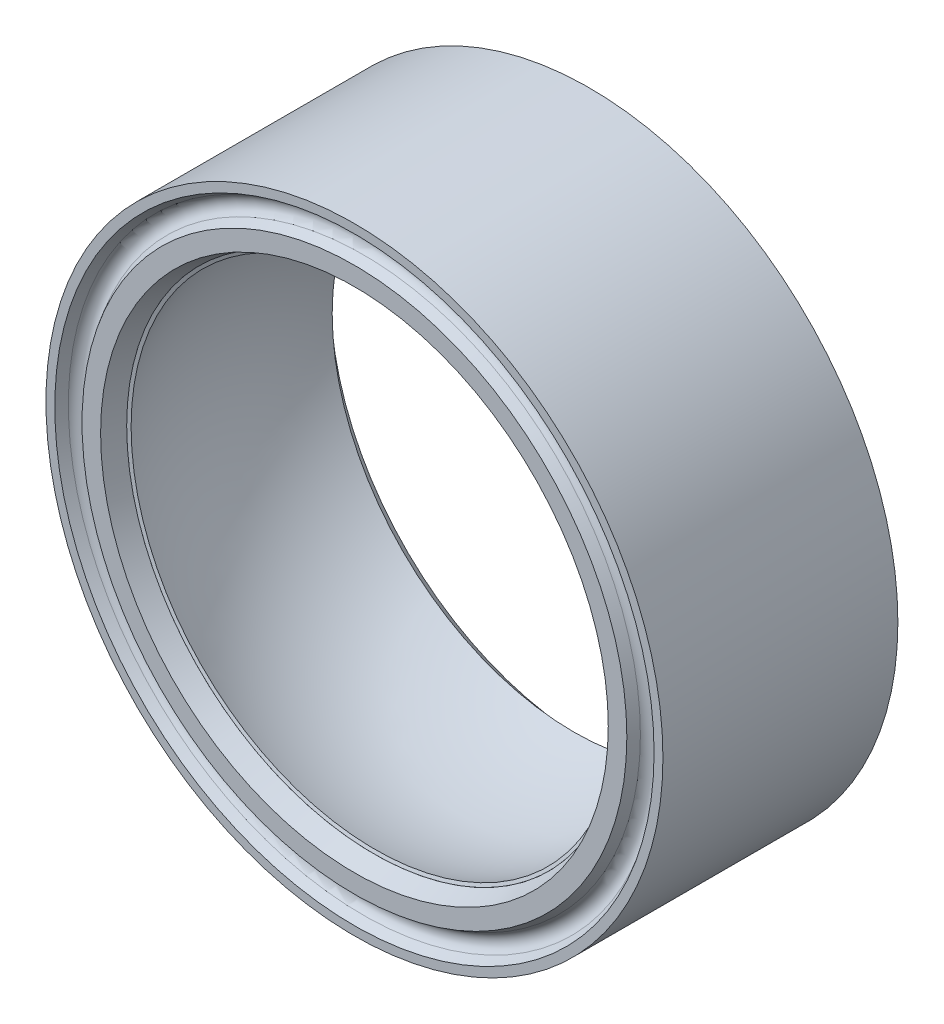
ISO-10303-21;
HEADER;
FILE_DESCRIPTION(('STEP AP214'),'2;1');
FILE_NAME('part.step','',(''),(''),'','','');
FILE_SCHEMA(('AUTOMOTIVE_DESIGN { 1 0 10303 214 1 1 1 1 }'));
ENDSEC;
DATA;
#1=APPLICATION_CONTEXT('core data for automotive mechanical design processes');
#2=APPLICATION_PROTOCOL_DEFINITION('international standard','automotive_design',2000,#1);
#3=PRODUCT_CONTEXT('',#1,'mechanical');
#4=PRODUCT('Part','Part','',(#3));
#5=PRODUCT_RELATED_PRODUCT_CATEGORY('part','',(#4));
#6=PRODUCT_DEFINITION_FORMATION('','',#4);
#7=PRODUCT_DEFINITION_CONTEXT('part definition',#1,'design');
#8=PRODUCT_DEFINITION('design','',#6,#7);
#9=PRODUCT_DEFINITION_SHAPE('','',#8);
#10=(LENGTH_UNIT() NAMED_UNIT(*) SI_UNIT(.MILLI.,.METRE.));
#11=(NAMED_UNIT(*) PLANE_ANGLE_UNIT() SI_UNIT($,.RADIAN.));
#12=(NAMED_UNIT(*) SI_UNIT($,.STERADIAN.) SOLID_ANGLE_UNIT());
#13=UNCERTAINTY_MEASURE_WITH_UNIT(LENGTH_MEASURE(1.E-05),#10,'distance_accuracy_value','');
#14=(GEOMETRIC_REPRESENTATION_CONTEXT(3) GLOBAL_UNCERTAINTY_ASSIGNED_CONTEXT((#13)) GLOBAL_UNIT_ASSIGNED_CONTEXT((#10,
#11,#12)) REPRESENTATION_CONTEXT('',''));
#15=CARTESIAN_POINT('',(0.,0.,0.));
#16=DIRECTION('',(0.,0.,1.));
#17=DIRECTION('',(1.,0.,0.));
#18=AXIS2_PLACEMENT_3D('',#15,#16,#17);
#19=CARTESIAN_POINT('',(0.,0.,3.65527883623637));
#20=DIRECTION('',(0.,0.,1.));
#21=DIRECTION('',(1.,0.,0.));
#22=AXIS2_PLACEMENT_3D('',#19,#20,#21);
#23=CONICAL_SURFACE('',#22,9.22060444436061,1.19337557294153);
#24=CARTESIAN_POINT('',(0.,0.,3.60847629031785));
#25=DIRECTION('',(0.,0.,-1.));
#26=DIRECTION('',(-1.,0.,0.));
#27=AXIS2_PLACEMENT_3D('',#24,#25,#26);
#28=CIRCLE('',#27,9.10254292778748);
#29=CARTESIAN_POINT('',(-9.10254292778748,0.,3.60847629031785));
#30=VERTEX_POINT('',#29);
#31=EDGE_CURVE('E57',#30,#30,#28,.F.);
#32=ORIENTED_EDGE('',*,*,#31,.F.);
#33=EDGE_LOOP('',(#32));
#34=FACE_BOUND('',#33,.T.);
#35=CARTESIAN_POINT('',(0.,0.,3.65527883623637));
#36=DIRECTION('',(0.,0.,-1.));
#37=DIRECTION('',(-1.,0.,0.));
#38=AXIS2_PLACEMENT_3D('',#35,#36,#37);
#39=CIRCLE('',#38,9.22060444436061);
#40=CARTESIAN_POINT('',(-9.22060444436061,0.,3.65527883623637));
#41=VERTEX_POINT('',#40);
#42=EDGE_CURVE('E63',#41,#41,#39,.F.);
#43=ORIENTED_EDGE('',*,*,#42,.T.);
#44=EDGE_LOOP('',(#43));
#45=FACE_BOUND('',#44,.T.);
#46=ADVANCED_FACE('F49',(#34,#45),#23,.F.);
#47=CARTESIAN_POINT('',(0.,0.,-3.85845853732329));
#48=DIRECTION('',(0.,0.,-1.));
#49=DIRECTION('',(-1.,0.,0.));
#50=AXIS2_PLACEMENT_3D('',#47,#48,#49);
#51=CONICAL_SURFACE('',#50,9.13744534351681,1.17124126040998);
#52=CARTESIAN_POINT('',(0.,0.,-3.80905445874041));
#53=DIRECTION('',(0.,0.,1.));
#54=DIRECTION('',(1.,0.,0.));
#55=AXIS2_PLACEMENT_3D('',#52,#53,#54);
#56=CIRCLE('',#55,9.0204486041632);
#57=CARTESIAN_POINT('',(9.0204486041632,0.,-3.80905445874041));
#58=VERTEX_POINT('',#57);
#59=EDGE_CURVE('E11',#58,#58,#56,.F.);
#60=ORIENTED_EDGE('',*,*,#59,.F.);
#61=EDGE_LOOP('',(#60));
#62=FACE_BOUND('',#61,.T.);
#63=CARTESIAN_POINT('',(0.,0.,-3.85845853732329));
#64=DIRECTION('',(0.,0.,1.));
#65=DIRECTION('',(1.,0.,0.));
#66=AXIS2_PLACEMENT_3D('',#63,#64,#65);
#67=CIRCLE('',#66,9.13744534351681);
#68=CARTESIAN_POINT('',(9.13744534351681,0.,-3.85845853732329));
#69=VERTEX_POINT('',#68);
#70=EDGE_CURVE('E53',#69,#69,#67,.F.);
#71=ORIENTED_EDGE('',*,*,#70,.T.);
#72=EDGE_LOOP('',(#71));
#73=FACE_BOUND('',#72,.T.);
#74=ADVANCED_FACE('F51',(#62,#73),#51,.F.);
#75=CARTESIAN_POINT('',(0.,0.,0.));
#76=DIRECTION('',(-1.,0.,0.));
#77=DIRECTION('',(0.,1.,0.));
#78=AXIS2_PLACEMENT_3D('',#75,#76,#77);
#79=SPHERICAL_SURFACE('',#78,9.7917);
#80=CARTESIAN_POINT('',(0.,0.,0.));
#81=DIRECTION('',(0.,0.,-1.));
#82=DIRECTION('',(-1.,0.,0.));
#83=AXIS2_PLACEMENT_3D('',#80,#81,#82);
#84=SPHERICAL_SURFACE('',#83,9.7917);
#85=ORIENTED_EDGE('',*,*,#31,.T.);
#86=EDGE_LOOP('',(#85));
#87=FACE_BOUND('',#86,.T.);
#88=ORIENTED_EDGE('',*,*,#59,.T.);
#89=EDGE_LOOP('',(#88));
#90=FACE_BOUND('',#89,.T.);
#91=ADVANCED_FACE('F73',(#87,#90),#84,.F.);
#92=CARTESIAN_POINT('',(0.,0.,0.));
#93=DIRECTION('',(-1.,0.,0.));
#94=DIRECTION('',(0.,1.,0.));
#95=AXIS2_PLACEMENT_3D('',#92,#93,#94);
#96=SPHERICAL_SURFACE('',#95,9.9187);
#97=CARTESIAN_POINT('',(0.,0.,0.));
#98=DIRECTION('',(0.,0.,-1.));
#99=DIRECTION('',(-1.,0.,0.));
#100=AXIS2_PLACEMENT_3D('',#97,#98,#99);
#101=SPHERICAL_SURFACE('',#100,9.9187);
#102=ORIENTED_EDGE('',*,*,#42,.F.);
#103=EDGE_LOOP('',(#102));
#104=FACE_BOUND('',#103,.T.);
#105=ORIENTED_EDGE('',*,*,#70,.F.);
#106=EDGE_LOOP('',(#105));
#107=FACE_BOUND('',#106,.T.);
#108=ADVANCED_FACE('F71',(#104,#107),#101,.T.);
#109=CLOSED_SHELL('',(#46,#74,#91,#108));
#110=MANIFOLD_SOLID_BREP('B2',#109);
#111=CARTESIAN_POINT('',(0.,0.,4.3815));
#112=DIRECTION('',(0.,0.,1.));
#113=DIRECTION('',(1.,0.,0.));
#114=AXIS2_PLACEMENT_3D('',#111,#112,#113);
#115=PLANE('',#114);
#116=CARTESIAN_POINT('',(0.,0.,4.3815));
#117=DIRECTION('',(0.,0.,1.));
#118=DIRECTION('',(1.,0.,0.));
#119=AXIS2_PLACEMENT_3D('',#116,#117,#118);
#120=CIRCLE('',#119,11.5062);
#121=CARTESIAN_POINT('',(11.5062,0.,4.3815));
#122=VERTEX_POINT('',#121);
#123=EDGE_CURVE('E134',#122,#122,#120,.T.);
#124=ORIENTED_EDGE('',*,*,#123,.T.);
#125=EDGE_LOOP('',(#124));
#126=FACE_BOUND('',#125,.T.);
#127=CARTESIAN_POINT('',(0.,0.,4.3815));
#128=DIRECTION('',(0.,0.,1.));
#129=DIRECTION('',(1.,0.,0.));
#130=AXIS2_PLACEMENT_3D('',#127,#128,#129);
#131=CIRCLE('',#130,11.176);
#132=CARTESIAN_POINT('',(11.176,0.,4.3815));
#133=VERTEX_POINT('',#132);
#134=EDGE_CURVE('E158',#133,#133,#131,.T.);
#135=ORIENTED_EDGE('',*,*,#134,.F.);
#136=EDGE_LOOP('',(#135));
#137=FACE_BOUND('',#136,.T.);
#138=ADVANCED_FACE('F110',(#126,#137),#115,.T.);
#139=CARTESIAN_POINT('',(0.,0.,4.3815));
#140=DIRECTION('',(0.,0.,1.));
#141=DIRECTION('',(1.,0.,0.));
#142=AXIS2_PLACEMENT_3D('',#139,#140,#141);
#143=CIRCLE('',#142,9.46761759753399);
#144=CARTESIAN_POINT('',(9.46761759753399,0.,4.3815));
#145=VERTEX_POINT('',#144);
#146=EDGE_CURVE('E128',#145,#145,#143,.F.);
#147=ORIENTED_EDGE('',*,*,#146,.T.);
#148=EDGE_LOOP('',(#147));
#149=FACE_BOUND('',#148,.T.);
#150=CARTESIAN_POINT('',(0.,0.,4.3815));
#151=DIRECTION('',(0.,0.,1.));
#152=DIRECTION('',(1.,0.,0.));
#153=AXIS2_PLACEMENT_3D('',#150,#151,#152);
#154=CIRCLE('',#153,10.16);
#155=CARTESIAN_POINT('',(10.16,0.,4.3815));
#156=VERTEX_POINT('',#155);
#157=EDGE_CURVE('E170',#156,#156,#154,.T.);
#158=ORIENTED_EDGE('',*,*,#157,.T.);
#159=EDGE_LOOP('',(#158));
#160=FACE_BOUND('',#159,.T.);
#161=ADVANCED_FACE('F175',(#149,#160),#115,.T.);
#162=CARTESIAN_POINT('',(0.,0.,-4.3815));
#163=DIRECTION('',(0.,0.,1.));
#164=DIRECTION('',(1.,0.,0.));
#165=AXIS2_PLACEMENT_3D('',#162,#163,#164);
#166=PLANE('',#165);
#167=CARTESIAN_POINT('',(0.,0.,-4.3815));
#168=DIRECTION('',(0.,0.,1.));
#169=DIRECTION('',(1.,0.,0.));
#170=AXIS2_PLACEMENT_3D('',#167,#168,#169);
#171=CIRCLE('',#170,11.5062);
#172=CARTESIAN_POINT('',(11.5062,0.,-4.3815));
#173=VERTEX_POINT('',#172);
#174=EDGE_CURVE('E135',#173,#173,#171,.T.);
#175=ORIENTED_EDGE('',*,*,#174,.F.);
#176=EDGE_LOOP('',(#175));
#177=FACE_BOUND('',#176,.T.);
#178=CARTESIAN_POINT('',(0.,0.,-4.3815));
#179=DIRECTION('',(0.,0.,1.));
#180=DIRECTION('',(1.,0.,0.));
#181=AXIS2_PLACEMENT_3D('',#178,#179,#180);
#182=CIRCLE('',#181,11.176);
#183=CARTESIAN_POINT('',(11.176,0.,-4.3815));
#184=VERTEX_POINT('',#183);
#185=EDGE_CURVE('E139',#184,#184,#182,.T.);
#186=ORIENTED_EDGE('',*,*,#185,.T.);
#187=EDGE_LOOP('',(#186));
#188=FACE_BOUND('',#187,.T.);
#189=ADVANCED_FACE('F202',(#177,#188),#166,.F.);
#190=CARTESIAN_POINT('',(0.,0.,-4.3815));
#191=DIRECTION('',(0.,0.,1.));
#192=DIRECTION('',(1.,0.,0.));
#193=AXIS2_PLACEMENT_3D('',#190,#191,#192);
#194=CIRCLE('',#193,9.66048680619352);
#195=CARTESIAN_POINT('',(9.66048680619352,0.,-4.3815));
#196=VERTEX_POINT('',#195);
#197=EDGE_CURVE('E48',#196,#196,#194,.T.);
#198=ORIENTED_EDGE('',*,*,#197,.T.);
#199=EDGE_LOOP('',(#198));
#200=FACE_BOUND('',#199,.T.);
#201=CARTESIAN_POINT('',(0.,0.,-4.3815));
#202=DIRECTION('',(0.,0.,1.));
#203=DIRECTION('',(1.,0.,0.));
#204=AXIS2_PLACEMENT_3D('',#201,#202,#203);
#205=CIRCLE('',#204,10.16);
#206=CARTESIAN_POINT('',(10.16,0.,-4.3815));
#207=VERTEX_POINT('',#206);
#208=EDGE_CURVE('E154',#207,#207,#205,.T.);
#209=ORIENTED_EDGE('',*,*,#208,.F.);
#210=EDGE_LOOP('',(#209));
#211=FACE_BOUND('',#210,.T.);
#212=ADVANCED_FACE('F210',(#200,#211),#166,.F.);
#213=CARTESIAN_POINT('',(0.,0.,4.3815));
#214=DIRECTION('',(0.,0.,-1.));
#215=DIRECTION('',(-1.,0.,0.));
#216=AXIS2_PLACEMENT_3D('',#213,#214,#215);
#217=CYLINDRICAL_SURFACE('',#216,11.5062);
#218=ORIENTED_EDGE('',*,*,#123,.F.);
#219=EDGE_LOOP('',(#218));
#220=FACE_BOUND('',#219,.T.);
#221=ORIENTED_EDGE('',*,*,#174,.T.);
#222=EDGE_LOOP('',(#221));
#223=FACE_BOUND('',#222,.T.);
#224=ADVANCED_FACE('F212',(#220,#223),#217,.T.);
#225=CARTESIAN_POINT('',(0.,0.,0.));
#226=DIRECTION('',(-1.,0.,0.));
#227=DIRECTION('',(0.,1.,0.));
#228=AXIS2_PLACEMENT_3D('',#225,#226,#227);
#229=SPHERICAL_SURFACE('',#228,9.9187);
#230=CARTESIAN_POINT('',(0.,0.,0.));
#231=DIRECTION('',(0.,0.,-1.));
#232=DIRECTION('',(-1.,0.,0.));
#233=AXIS2_PLACEMENT_3D('',#230,#231,#232);
#234=SPHERICAL_SURFACE('',#233,9.9187);
#235=CARTESIAN_POINT('',(0.,0.,3.65527883623637));
#236=DIRECTION('',(0.,0.,-1.));
#237=DIRECTION('',(-1.,0.,0.));
#238=AXIS2_PLACEMENT_3D('',#235,#236,#237);
#239=CIRCLE('',#238,9.22060444436061);
#240=CARTESIAN_POINT('',(-9.22060444436061,0.,3.65527883623637));
#241=VERTEX_POINT('',#240);
#242=EDGE_CURVE('E118',#241,#241,#239,.F.);
#243=ORIENTED_EDGE('',*,*,#242,.T.);
#244=EDGE_LOOP('',(#243));
#245=FACE_BOUND('',#244,.T.);
#246=CARTESIAN_POINT('',(0.,0.,-3.85845853732329));
#247=DIRECTION('',(0.,0.,1.));
#248=DIRECTION('',(1.,0.,0.));
#249=AXIS2_PLACEMENT_3D('',#246,#247,#248);
#250=CIRCLE('',#249,9.13744534351681);
#251=CARTESIAN_POINT('',(9.13744534351681,0.,-3.85845853732329));
#252=VERTEX_POINT('',#251);
#253=EDGE_CURVE('E123',#252,#252,#250,.F.);
#254=ORIENTED_EDGE('',*,*,#253,.T.);
#255=EDGE_LOOP('',(#254));
#256=FACE_BOUND('',#255,.T.);
#257=ADVANCED_FACE('F206',(#245,#256),#234,.F.);
#258=CARTESIAN_POINT('',(0.,0.,4.3815));
#259=DIRECTION('',(0.,0.,1.));
#260=DIRECTION('',(1.,0.,0.));
#261=AXIS2_PLACEMENT_3D('',#258,#259,#260);
#262=CONICAL_SURFACE('',#261,9.46761759753399,0.327859411263248);
#263=ORIENTED_EDGE('',*,*,#242,.F.);
#264=EDGE_LOOP('',(#263));
#265=FACE_BOUND('',#264,.T.);
#266=ORIENTED_EDGE('',*,*,#146,.F.);
#267=EDGE_LOOP('',(#266));
#268=FACE_BOUND('',#267,.T.);
#269=ADVANCED_FACE('F215',(#265,#268),#262,.F.);
#270=CARTESIAN_POINT('',(0.,0.,-3.85845853732329));
#271=DIRECTION('',(0.,0.,-1.));
#272=DIRECTION('',(-1.,0.,0.));
#273=AXIS2_PLACEMENT_3D('',#270,#271,#272);
#274=CONICAL_SURFACE('',#273,9.13744534351681,0.785398163397454);
#275=ORIENTED_EDGE('',*,*,#197,.F.);
#276=EDGE_LOOP('',(#275));
#277=FACE_BOUND('',#276,.T.);
#278=ORIENTED_EDGE('',*,*,#253,.F.);
#279=EDGE_LOOP('',(#278));
#280=FACE_BOUND('',#279,.T.);
#281=ADVANCED_FACE('F112',(#277,#280),#274,.F.);
#282=CARTESIAN_POINT('',(0.,0.,-4.3815));
#283=DIRECTION('',(0.,0.,-1.));
#284=DIRECTION('',(-1.,0.,0.));
#285=AXIS2_PLACEMENT_3D('',#282,#283,#284);
#286=CONICAL_SURFACE('',#285,11.176,0.515871771712349);
#287=CARTESIAN_POINT('',(0.,0.,-4.05892));
#288=DIRECTION('',(0.,0.,1.));
#289=DIRECTION('',(1.,0.,0.));
#290=AXIS2_PLACEMENT_3D('',#287,#288,#289);
#291=CIRCLE('',#290,10.9930670909869);
#292=CARTESIAN_POINT('',(10.9930670909869,0.,-4.05892));
#293=VERTEX_POINT('',#292);
#294=EDGE_CURVE('E146',#293,#293,#291,.T.);
#295=ORIENTED_EDGE('',*,*,#294,.T.);
#296=EDGE_LOOP('',(#295));
#297=FACE_BOUND('',#296,.T.);
#298=ORIENTED_EDGE('',*,*,#185,.F.);
#299=EDGE_LOOP('',(#298));
#300=FACE_BOUND('',#299,.T.);
#301=ADVANCED_FACE('F222',(#297,#300),#286,.F.);
#302=CARTESIAN_POINT('',(0.,0.,-4.24326332128049));
#303=DIRECTION('',(0.,0.,1.));
#304=DIRECTION('',(1.,0.,0.));
#305=AXIS2_PLACEMENT_3D('',#302,#303,#304);
#306=TOROIDAL_SURFACE('',#305,10.668,0.37369917546524);
#307=CARTESIAN_POINT('',(0.,0.,-4.05892));
#308=DIRECTION('',(0.,0.,1.));
#309=DIRECTION('',(1.,0.,0.));
#310=AXIS2_PLACEMENT_3D('',#307,#308,#309);
#311=CIRCLE('',#310,10.3429329090131);
#312=CARTESIAN_POINT('',(10.3429329090131,0.,-4.05892));
#313=VERTEX_POINT('',#312);
#314=EDGE_CURVE('E150',#313,#313,#311,.T.);
#315=ORIENTED_EDGE('',*,*,#314,.T.);
#316=EDGE_LOOP('',(#315));
#317=FACE_BOUND('',#316,.T.);
#318=ORIENTED_EDGE('',*,*,#294,.F.);
#319=EDGE_LOOP('',(#318));
#320=FACE_BOUND('',#319,.T.);
#321=ADVANCED_FACE('F279',(#317,#320),#306,.F.);
#322=CARTESIAN_POINT('',(0.,0.,-4.05892));
#323=DIRECTION('',(0.,0.,1.));
#324=DIRECTION('',(1.,0.,0.));
#325=AXIS2_PLACEMENT_3D('',#322,#323,#324);
#326=CONICAL_SURFACE('',#325,10.3429329090131,0.515871771712349);
#327=ORIENTED_EDGE('',*,*,#208,.T.);
#328=EDGE_LOOP('',(#327));
#329=FACE_BOUND('',#328,.T.);
#330=ORIENTED_EDGE('',*,*,#314,.F.);
#331=EDGE_LOOP('',(#330));
#332=FACE_BOUND('',#331,.T.);
#333=ADVANCED_FACE('F192',(#329,#332),#326,.T.);
#334=CARTESIAN_POINT('',(0.,0.,4.3815));
#335=DIRECTION('',(0.,0.,1.));
#336=DIRECTION('',(-1.,0.,0.));
#337=AXIS2_PLACEMENT_3D('',#334,#335,#336);
#338=CONICAL_SURFACE('',#337,11.176,0.515871771712349);
#339=CARTESIAN_POINT('',(0.,0.,4.05892));
#340=DIRECTION('',(0.,0.,1.));
#341=DIRECTION('',(1.,0.,0.));
#342=AXIS2_PLACEMENT_3D('',#339,#340,#341);
#343=CIRCLE('',#342,10.9930670909869);
#344=CARTESIAN_POINT('',(10.9930670909869,0.,4.05892));
#345=VERTEX_POINT('',#344);
#346=EDGE_CURVE('E162',#345,#345,#343,.T.);
#347=ORIENTED_EDGE('',*,*,#346,.F.);
#348=EDGE_LOOP('',(#347));
#349=FACE_BOUND('',#348,.T.);
#350=ORIENTED_EDGE('',*,*,#134,.T.);
#351=EDGE_LOOP('',(#350));
#352=FACE_BOUND('',#351,.T.);
#353=ADVANCED_FACE('F186',(#349,#352),#338,.F.);
#354=CARTESIAN_POINT('',(0.,0.,4.24326332128049));
#355=DIRECTION('',(0.,0.,-1.));
#356=DIRECTION('',(1.,0.,0.));
#357=AXIS2_PLACEMENT_3D('',#354,#355,#356);
#358=TOROIDAL_SURFACE('',#357,10.668,0.37369917546524);
#359=CARTESIAN_POINT('',(0.,0.,4.05892));
#360=DIRECTION('',(0.,0.,1.));
#361=DIRECTION('',(1.,0.,0.));
#362=AXIS2_PLACEMENT_3D('',#359,#360,#361);
#363=CIRCLE('',#362,10.3429329090131);
#364=CARTESIAN_POINT('',(10.3429329090131,0.,4.05892));
#365=VERTEX_POINT('',#364);
#366=EDGE_CURVE('E166',#365,#365,#363,.T.);
#367=ORIENTED_EDGE('',*,*,#366,.F.);
#368=EDGE_LOOP('',(#367));
#369=FACE_BOUND('',#368,.T.);
#370=ORIENTED_EDGE('',*,*,#346,.T.);
#371=EDGE_LOOP('',(#370));
#372=FACE_BOUND('',#371,.T.);
#373=ADVANCED_FACE('F180',(#369,#372),#358,.F.);
#374=CARTESIAN_POINT('',(0.,0.,4.05892));
#375=DIRECTION('',(0.,0.,-1.));
#376=DIRECTION('',(1.,0.,0.));
#377=AXIS2_PLACEMENT_3D('',#374,#375,#376);
#378=CONICAL_SURFACE('',#377,10.3429329090131,0.515871771712349);
#379=ORIENTED_EDGE('',*,*,#157,.F.);
#380=EDGE_LOOP('',(#379));
#381=FACE_BOUND('',#380,.T.);
#382=ORIENTED_EDGE('',*,*,#366,.T.);
#383=EDGE_LOOP('',(#382));
#384=FACE_BOUND('',#383,.T.);
#385=ADVANCED_FACE('F177',(#381,#384),#378,.T.);
#386=CLOSED_SHELL('',(#138,#161,#189,#212,#224,#257,#269,#281,#301,#321,#333,#353,#373,#385));
#387=MANIFOLD_SOLID_BREP('B6',#386);
#388=ADVANCED_BREP_SHAPE_REPRESENTATION('',(#18,#110,#387),#14);
#389=SHAPE_DEFINITION_REPRESENTATION(#9,#388);
ENDSEC;
END-ISO-10303-21;
